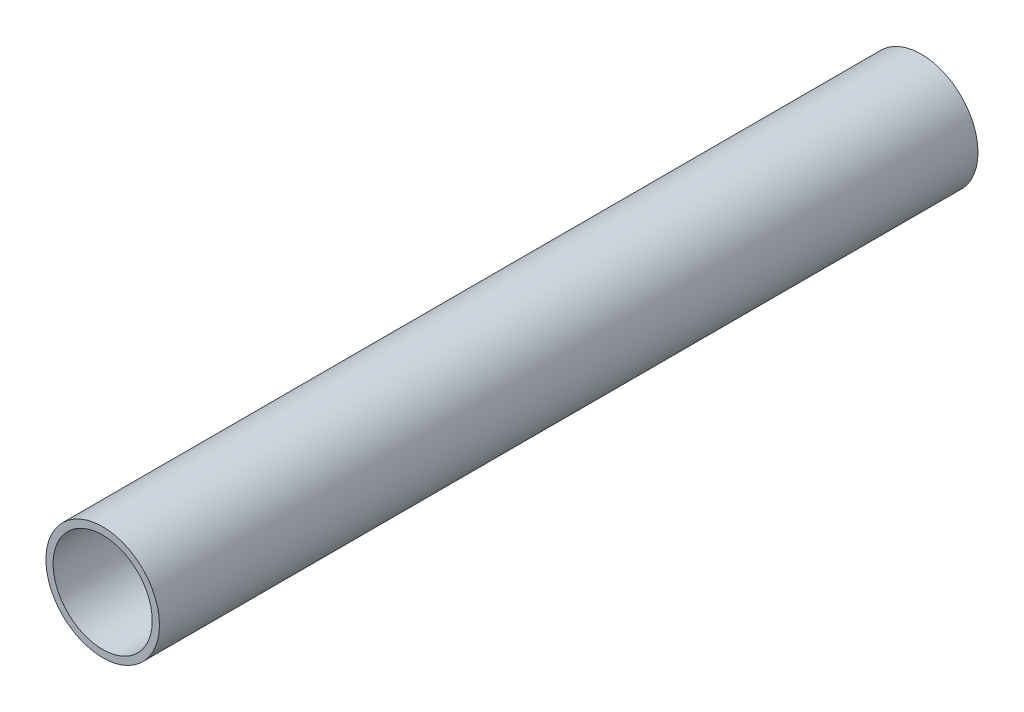
ISO-10303-21;
HEADER;
FILE_DESCRIPTION(('STEP AP214'),'2;1');
FILE_NAME('part.step','',(''),(''),'','','');
FILE_SCHEMA(('AUTOMOTIVE_DESIGN { 1 0 10303 214 1 1 1 1 }'));
ENDSEC;
DATA;
#1=APPLICATION_CONTEXT('core data for automotive mechanical design processes');
#2=APPLICATION_PROTOCOL_DEFINITION('international standard','automotive_design',2000,#1);
#3=PRODUCT_CONTEXT('',#1,'mechanical');
#4=PRODUCT('Part','Part','',(#3));
#5=PRODUCT_RELATED_PRODUCT_CATEGORY('part','',(#4));
#6=PRODUCT_DEFINITION_FORMATION('','',#4);
#7=PRODUCT_DEFINITION_CONTEXT('part definition',#1,'design');
#8=PRODUCT_DEFINITION('design','',#6,#7);
#9=PRODUCT_DEFINITION_SHAPE('','',#8);
#10=(LENGTH_UNIT() NAMED_UNIT(*) SI_UNIT(.MILLI.,.METRE.));
#11=(NAMED_UNIT(*) PLANE_ANGLE_UNIT() SI_UNIT($,.RADIAN.));
#12=(NAMED_UNIT(*) SI_UNIT($,.STERADIAN.) SOLID_ANGLE_UNIT());
#13=UNCERTAINTY_MEASURE_WITH_UNIT(LENGTH_MEASURE(1.E-05),#10,'distance_accuracy_value','');
#14=(GEOMETRIC_REPRESENTATION_CONTEXT(3) GLOBAL_UNCERTAINTY_ASSIGNED_CONTEXT((#13)) GLOBAL_UNIT_ASSIGNED_CONTEXT((#10,
#11,#12)) REPRESENTATION_CONTEXT('',''));
#15=CARTESIAN_POINT('',(0.,0.,0.));
#16=DIRECTION('',(0.,0.,1.));
#17=DIRECTION('',(1.,0.,0.));
#18=AXIS2_PLACEMENT_3D('',#15,#16,#17);
#19=CARTESIAN_POINT('',(0.,0.,130.));
#20=DIRECTION('',(0.,0.,1.));
#21=DIRECTION('',(1.,0.,0.));
#22=AXIS2_PLACEMENT_3D('',#19,#20,#21);
#23=PLANE('',#22);
#24=CARTESIAN_POINT('',(0.,0.,130.));
#25=DIRECTION('',(0.,0.,1.));
#26=DIRECTION('',(1.,0.,0.));
#27=AXIS2_PLACEMENT_3D('',#24,#25,#26);
#28=CIRCLE('',#27,9.017);
#29=CARTESIAN_POINT('',(9.017,0.,130.));
#30=VERTEX_POINT('',#29);
#31=EDGE_CURVE('E10',#30,#30,#28,.T.);
#32=ORIENTED_EDGE('',*,*,#31,.T.);
#33=EDGE_LOOP('',(#32));
#34=FACE_BOUND('',#33,.T.);
#35=CARTESIAN_POINT('',(0.,0.,130.));
#36=DIRECTION('',(0.,0.,1.));
#37=DIRECTION('',(1.,0.,0.));
#38=AXIS2_PLACEMENT_3D('',#35,#36,#37);
#39=CIRCLE('',#38,7.874);
#40=CARTESIAN_POINT('',(7.874,0.,130.));
#41=VERTEX_POINT('',#40);
#42=EDGE_CURVE('E42',#41,#41,#39,.T.);
#43=ORIENTED_EDGE('',*,*,#42,.F.);
#44=EDGE_LOOP('',(#43));
#45=FACE_BOUND('',#44,.T.);
#46=ADVANCED_FACE('F31',(#34,#45),#23,.T.);
#47=CARTESIAN_POINT('',(0.,0.,0.));
#48=DIRECTION('',(0.,0.,1.));
#49=DIRECTION('',(1.,0.,0.));
#50=AXIS2_PLACEMENT_3D('',#47,#48,#49);
#51=PLANE('',#50);
#52=CARTESIAN_POINT('',(0.,0.,0.));
#53=DIRECTION('',(0.,0.,1.));
#54=DIRECTION('',(1.,0.,0.));
#55=AXIS2_PLACEMENT_3D('',#52,#53,#54);
#56=CIRCLE('',#55,9.017);
#57=CARTESIAN_POINT('',(9.017,0.,0.));
#58=VERTEX_POINT('',#57);
#59=EDGE_CURVE('E35',#58,#58,#56,.T.);
#60=ORIENTED_EDGE('',*,*,#59,.F.);
#61=EDGE_LOOP('',(#60));
#62=FACE_BOUND('',#61,.T.);
#63=CARTESIAN_POINT('',(0.,0.,0.));
#64=DIRECTION('',(0.,0.,1.));
#65=DIRECTION('',(1.,0.,0.));
#66=AXIS2_PLACEMENT_3D('',#63,#64,#65);
#67=CIRCLE('',#66,7.874);
#68=CARTESIAN_POINT('',(7.874,0.,0.));
#69=VERTEX_POINT('',#68);
#70=EDGE_CURVE('E44',#69,#69,#67,.T.);
#71=ORIENTED_EDGE('',*,*,#70,.T.);
#72=EDGE_LOOP('',(#71));
#73=FACE_BOUND('',#72,.T.);
#74=ADVANCED_FACE('F54',(#62,#73),#51,.F.);
#75=CARTESIAN_POINT('',(0.,0.,130.));
#76=DIRECTION('',(0.,0.,-1.));
#77=DIRECTION('',(-1.,0.,0.));
#78=AXIS2_PLACEMENT_3D('',#75,#76,#77);
#79=CYLINDRICAL_SURFACE('',#78,9.017);
#80=ORIENTED_EDGE('',*,*,#31,.F.);
#81=EDGE_LOOP('',(#80));
#82=FACE_BOUND('',#81,.T.);
#83=ORIENTED_EDGE('',*,*,#59,.T.);
#84=EDGE_LOOP('',(#83));
#85=FACE_BOUND('',#84,.T.);
#86=ADVANCED_FACE('F33',(#82,#85),#79,.T.);
#87=CARTESIAN_POINT('',(0.,0.,130.));
#88=DIRECTION('',(0.,0.,-1.));
#89=DIRECTION('',(-1.,0.,0.));
#90=AXIS2_PLACEMENT_3D('',#87,#88,#89);
#91=CYLINDRICAL_SURFACE('',#90,7.874);
#92=ORIENTED_EDGE('',*,*,#42,.T.);
#93=EDGE_LOOP('',(#92));
#94=FACE_BOUND('',#93,.T.);
#95=ORIENTED_EDGE('',*,*,#70,.F.);
#96=EDGE_LOOP('',(#95));
#97=FACE_BOUND('',#96,.T.);
#98=ADVANCED_FACE('F50',(#94,#97),#91,.F.);
#99=CLOSED_SHELL('',(#46,#74,#86,#98));
#100=MANIFOLD_SOLID_BREP('B2',#99);
#101=ADVANCED_BREP_SHAPE_REPRESENTATION('',(#18,#100),#14);
#102=SHAPE_DEFINITION_REPRESENTATION(#9,#101);
ENDSEC;
END-ISO-10303-21;
